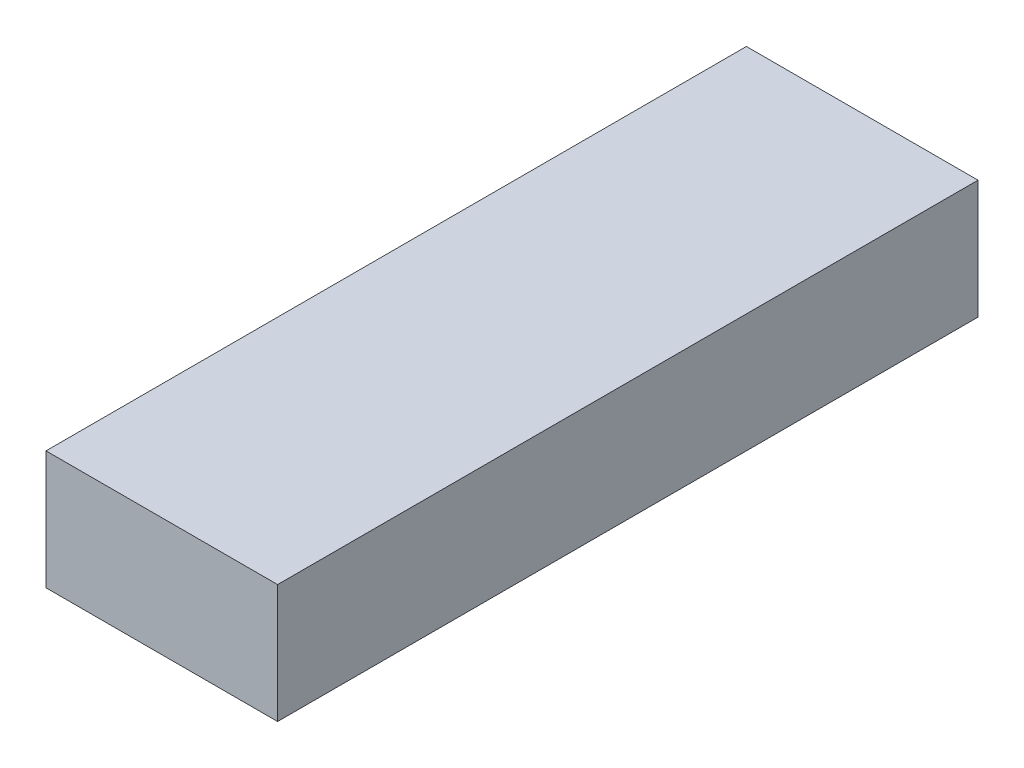
ISO-10303-21;
HEADER;
FILE_DESCRIPTION(('STEP AP214'),'2;1');
FILE_NAME('part.step','',(''),(''),'','','');
FILE_SCHEMA(('AUTOMOTIVE_DESIGN { 1 0 10303 214 1 1 1 1 }'));
ENDSEC;
DATA;
#1=APPLICATION_CONTEXT('core data for automotive mechanical design processes');
#2=APPLICATION_PROTOCOL_DEFINITION('international standard','automotive_design',2000,#1);
#3=PRODUCT_CONTEXT('',#1,'mechanical');
#4=PRODUCT('Part','Part','',(#3));
#5=PRODUCT_RELATED_PRODUCT_CATEGORY('part','',(#4));
#6=PRODUCT_DEFINITION_FORMATION('','',#4);
#7=PRODUCT_DEFINITION_CONTEXT('part definition',#1,'design');
#8=PRODUCT_DEFINITION('design','',#6,#7);
#9=PRODUCT_DEFINITION_SHAPE('','',#8);
#10=(LENGTH_UNIT() NAMED_UNIT(*) SI_UNIT(.MILLI.,.METRE.));
#11=(NAMED_UNIT(*) PLANE_ANGLE_UNIT() SI_UNIT($,.RADIAN.));
#12=(NAMED_UNIT(*) SI_UNIT($,.STERADIAN.) SOLID_ANGLE_UNIT());
#13=UNCERTAINTY_MEASURE_WITH_UNIT(LENGTH_MEASURE(1.E-05),#10,'distance_accuracy_value','');
#14=(GEOMETRIC_REPRESENTATION_CONTEXT(3) GLOBAL_UNCERTAINTY_ASSIGNED_CONTEXT((#13)) GLOBAL_UNIT_ASSIGNED_CONTEXT((#10,
#11,#12)) REPRESENTATION_CONTEXT('',''));
#15=CARTESIAN_POINT('',(0.,0.,0.));
#16=DIRECTION('',(0.,0.,1.));
#17=DIRECTION('',(1.,0.,0.));
#18=AXIS2_PLACEMENT_3D('',#15,#16,#17);
#19=CARTESIAN_POINT('',(20.5,10.5,124.));
#20=DIRECTION('',(-1.,0.,0.));
#21=DIRECTION('',(0.,0.,1.));
#22=AXIS2_PLACEMENT_3D('',#19,#20,#21);
#23=PLANE('',#22);
#24=DIRECTION('',(0.,1.,0.));
#25=VECTOR('',#24,1.);
#26=CARTESIAN_POINT('',(20.5,10.5,0.));
#27=LINE('',#26,#25);
#28=CARTESIAN_POINT('',(20.5,-10.5,0.));
#29=VERTEX_POINT('',#28);
#30=CARTESIAN_POINT('',(20.5,10.5,0.));
#31=VERTEX_POINT('',#30);
#32=EDGE_CURVE('E94',#29,#31,#27,.T.);
#33=ORIENTED_EDGE('',*,*,#32,.T.);
#34=DIRECTION('',(0.,0.,-1.));
#35=VECTOR('',#34,1.);
#36=CARTESIAN_POINT('',(20.5,10.5,124.));
#37=LINE('',#36,#35);
#38=CARTESIAN_POINT('',(20.5,10.5,124.));
#39=VERTEX_POINT('',#38);
#40=EDGE_CURVE('E11',#39,#31,#37,.T.);
#41=ORIENTED_EDGE('',*,*,#40,.F.);
#42=DIRECTION('',(0.,1.,0.));
#43=VECTOR('',#42,1.);
#44=CARTESIAN_POINT('',(20.5,10.5,124.));
#45=LINE('',#44,#43);
#46=CARTESIAN_POINT('',(20.5,-10.5,124.));
#47=VERTEX_POINT('',#46);
#48=EDGE_CURVE('E82',#47,#39,#45,.T.);
#49=ORIENTED_EDGE('',*,*,#48,.F.);
#50=DIRECTION('',(0.,0.,-1.));
#51=VECTOR('',#50,1.);
#52=CARTESIAN_POINT('',(20.5,-10.5,124.));
#53=LINE('',#52,#51);
#54=EDGE_CURVE('E90',#47,#29,#53,.T.);
#55=ORIENTED_EDGE('',*,*,#54,.T.);
#56=EDGE_LOOP('',(#33,#41,#49,#55));
#57=FACE_BOUND('',#56,.T.);
#58=ADVANCED_FACE('F31',(#57),#23,.F.);
#59=CARTESIAN_POINT('',(-20.5,10.5,124.));
#60=DIRECTION('',(0.,-1.,0.));
#61=DIRECTION('',(0.,0.,-1.));
#62=AXIS2_PLACEMENT_3D('',#59,#60,#61);
#63=PLANE('',#62);
#64=DIRECTION('',(-1.,0.,0.));
#65=VECTOR('',#64,1.);
#66=CARTESIAN_POINT('',(-20.5,10.5,0.));
#67=LINE('',#66,#65);
#68=CARTESIAN_POINT('',(-20.5,10.5,0.));
#69=VERTEX_POINT('',#68);
#70=EDGE_CURVE('E86',#31,#69,#67,.T.);
#71=ORIENTED_EDGE('',*,*,#70,.T.);
#72=DIRECTION('',(0.,0.,-1.));
#73=VECTOR('',#72,1.);
#74=CARTESIAN_POINT('',(-20.5,10.5,124.));
#75=LINE('',#74,#73);
#76=CARTESIAN_POINT('',(-20.5,10.5,124.));
#77=VERTEX_POINT('',#76);
#78=EDGE_CURVE('E39',#77,#69,#75,.T.);
#79=ORIENTED_EDGE('',*,*,#78,.F.);
#80=DIRECTION('',(-1.,0.,0.));
#81=VECTOR('',#80,1.);
#82=CARTESIAN_POINT('',(-20.5,10.5,124.));
#83=LINE('',#82,#81);
#84=EDGE_CURVE('E77',#39,#77,#83,.T.);
#85=ORIENTED_EDGE('',*,*,#84,.F.);
#86=ORIENTED_EDGE('',*,*,#40,.T.);
#87=EDGE_LOOP('',(#71,#79,#85,#86));
#88=FACE_BOUND('',#87,.T.);
#89=ADVANCED_FACE('F85',(#88),#63,.F.);
#90=CARTESIAN_POINT('',(-20.5,10.5,124.));
#91=DIRECTION('',(1.,0.,0.));
#92=DIRECTION('',(0.,0.,-1.));
#93=AXIS2_PLACEMENT_3D('',#90,#91,#92);
#94=PLANE('',#93);
#95=DIRECTION('',(0.,-1.,0.));
#96=VECTOR('',#95,1.);
#97=CARTESIAN_POINT('',(-20.5,10.5,0.));
#98=LINE('',#97,#96);
#99=CARTESIAN_POINT('',(-20.5,-10.5,0.));
#100=VERTEX_POINT('',#99);
#101=EDGE_CURVE('E64',#69,#100,#98,.T.);
#102=ORIENTED_EDGE('',*,*,#101,.T.);
#103=DIRECTION('',(0.,0.,-1.));
#104=VECTOR('',#103,1.);
#105=CARTESIAN_POINT('',(-20.5,-10.5,124.));
#106=LINE('',#105,#104);
#107=CARTESIAN_POINT('',(-20.5,-10.5,124.));
#108=VERTEX_POINT('',#107);
#109=EDGE_CURVE('E87',#108,#100,#106,.T.);
#110=ORIENTED_EDGE('',*,*,#109,.F.);
#111=DIRECTION('',(0.,-1.,0.));
#112=VECTOR('',#111,1.);
#113=CARTESIAN_POINT('',(-20.5,10.5,124.));
#114=LINE('',#113,#112);
#115=EDGE_CURVE('E80',#77,#108,#114,.T.);
#116=ORIENTED_EDGE('',*,*,#115,.F.);
#117=ORIENTED_EDGE('',*,*,#78,.T.);
#118=EDGE_LOOP('',(#102,#110,#116,#117));
#119=FACE_BOUND('',#118,.T.);
#120=ADVANCED_FACE('F88',(#119),#94,.F.);
#121=CARTESIAN_POINT('',(-20.5,-10.5,124.));
#122=DIRECTION('',(0.,1.,0.));
#123=DIRECTION('',(0.,0.,1.));
#124=AXIS2_PLACEMENT_3D('',#121,#122,#123);
#125=PLANE('',#124);
#126=DIRECTION('',(1.,0.,0.));
#127=VECTOR('',#126,1.);
#128=CARTESIAN_POINT('',(-20.5,-10.5,0.));
#129=LINE('',#128,#127);
#130=EDGE_CURVE('E70',#100,#29,#129,.T.);
#131=ORIENTED_EDGE('',*,*,#130,.T.);
#132=ORIENTED_EDGE('',*,*,#54,.F.);
#133=DIRECTION('',(1.,0.,0.));
#134=VECTOR('',#133,1.);
#135=CARTESIAN_POINT('',(-20.5,-10.5,124.));
#136=LINE('',#135,#134);
#137=EDGE_CURVE('E47',#108,#47,#136,.T.);
#138=ORIENTED_EDGE('',*,*,#137,.F.);
#139=ORIENTED_EDGE('',*,*,#109,.T.);
#140=EDGE_LOOP('',(#131,#132,#138,#139));
#141=FACE_BOUND('',#140,.T.);
#142=ADVANCED_FACE('F101',(#141),#125,.F.);
#143=CARTESIAN_POINT('',(20.5,-10.5,124.));
#144=DIRECTION('',(0.,0.,1.));
#145=DIRECTION('',(1.,0.,0.));
#146=AXIS2_PLACEMENT_3D('',#143,#144,#145);
#147=PLANE('',#146);
#148=ORIENTED_EDGE('',*,*,#48,.T.);
#149=ORIENTED_EDGE('',*,*,#84,.T.);
#150=ORIENTED_EDGE('',*,*,#115,.T.);
#151=ORIENTED_EDGE('',*,*,#137,.T.);
#152=EDGE_LOOP('',(#148,#149,#150,#151));
#153=FACE_BOUND('',#152,.T.);
#154=ADVANCED_FACE('F78',(#153),#147,.T.);
#155=CARTESIAN_POINT('',(20.5,-10.5,0.));
#156=DIRECTION('',(0.,0.,1.));
#157=DIRECTION('',(1.,0.,0.));
#158=AXIS2_PLACEMENT_3D('',#155,#156,#157);
#159=PLANE('',#158);
#160=ORIENTED_EDGE('',*,*,#32,.F.);
#161=ORIENTED_EDGE('',*,*,#130,.F.);
#162=ORIENTED_EDGE('',*,*,#101,.F.);
#163=ORIENTED_EDGE('',*,*,#70,.F.);
#164=EDGE_LOOP('',(#160,#161,#162,#163));
#165=FACE_BOUND('',#164,.T.);
#166=ADVANCED_FACE('F104',(#165),#159,.F.);
#167=CLOSED_SHELL('',(#58,#89,#120,#142,#154,#166));
#168=MANIFOLD_SOLID_BREP('B2',#167);
#169=ADVANCED_BREP_SHAPE_REPRESENTATION('',(#18,#168),#14);
#170=SHAPE_DEFINITION_REPRESENTATION(#9,#169);
ENDSEC;
END-ISO-10303-21;
